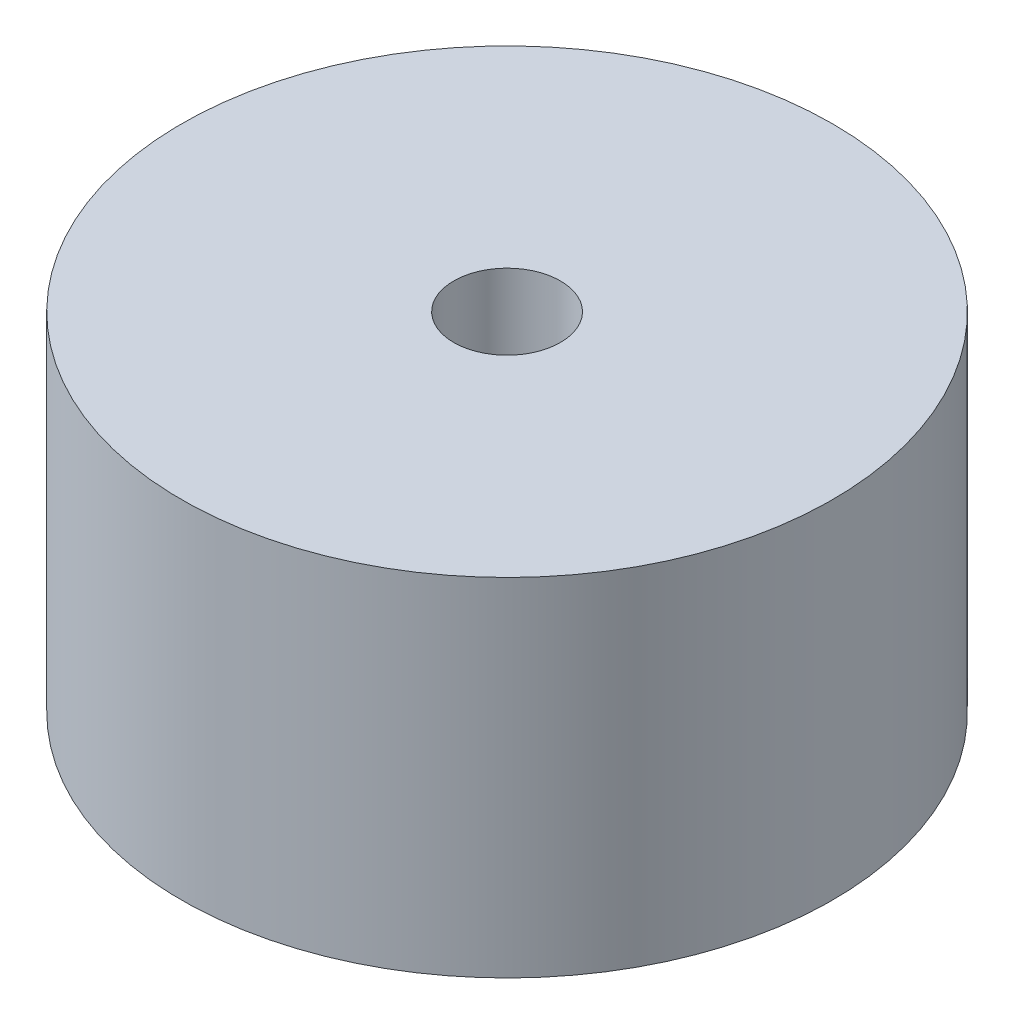
ISO-10303-21;
HEADER;
FILE_DESCRIPTION(('STEP AP214'),'2;1');
FILE_NAME('part.step','',(''),(''),'','','');
FILE_SCHEMA(('AUTOMOTIVE_DESIGN { 1 0 10303 214 1 1 1 1 }'));
ENDSEC;
DATA;
#1=APPLICATION_CONTEXT('core data for automotive mechanical design processes');
#2=APPLICATION_PROTOCOL_DEFINITION('international standard','automotive_design',2000,#1);
#3=PRODUCT_CONTEXT('',#1,'mechanical');
#4=PRODUCT('Part','Part','',(#3));
#5=PRODUCT_RELATED_PRODUCT_CATEGORY('part','',(#4));
#6=PRODUCT_DEFINITION_FORMATION('','',#4);
#7=PRODUCT_DEFINITION_CONTEXT('part definition',#1,'design');
#8=PRODUCT_DEFINITION('design','',#6,#7);
#9=PRODUCT_DEFINITION_SHAPE('','',#8);
#10=(LENGTH_UNIT() NAMED_UNIT(*) SI_UNIT(.MILLI.,.METRE.));
#11=(NAMED_UNIT(*) PLANE_ANGLE_UNIT() SI_UNIT($,.RADIAN.));
#12=(NAMED_UNIT(*) SI_UNIT($,.STERADIAN.) SOLID_ANGLE_UNIT());
#13=UNCERTAINTY_MEASURE_WITH_UNIT(LENGTH_MEASURE(1.E-05),#10,'distance_accuracy_value','');
#14=(GEOMETRIC_REPRESENTATION_CONTEXT(3) GLOBAL_UNCERTAINTY_ASSIGNED_CONTEXT((#13)) GLOBAL_UNIT_ASSIGNED_CONTEXT((#10,
#11,#12)) REPRESENTATION_CONTEXT('',''));
#15=CARTESIAN_POINT('',(0.,0.,0.));
#16=DIRECTION('',(0.,0.,1.));
#17=DIRECTION('',(1.,0.,0.));
#18=AXIS2_PLACEMENT_3D('',#15,#16,#17);
#19=CARTESIAN_POINT('',(19.4431838187371,6.5,18.3068938553047));
#20=DIRECTION('',(0.,-1.,0.));
#21=DIRECTION('',(0.,0.,-1.));
#22=AXIS2_PLACEMENT_3D('',#19,#20,#21);
#23=CYLINDRICAL_SURFACE('',#22,6.1);
#24=CARTESIAN_POINT('',(19.4431838187371,6.5,18.3068938553047));
#25=DIRECTION('',(0.,1.,0.));
#26=DIRECTION('',(0.,0.,1.));
#27=AXIS2_PLACEMENT_3D('',#24,#25,#26);
#28=CIRCLE('',#27,6.1);
#29=CARTESIAN_POINT('',(19.4431838187371,6.5,12.2068938553047));
#30=VERTEX_POINT('',#29);
#31=EDGE_CURVE('E10',#30,#30,#28,.T.);
#32=CARTESIAN_POINT('',(19.4431838187371,0.,18.3068938553047));
#33=DIRECTION('',(0.,1.,0.));
#34=DIRECTION('',(0.,0.,1.));
#35=AXIS2_PLACEMENT_3D('',#32,#33,#34);
#36=CIRCLE('',#35,6.1);
#37=CARTESIAN_POINT('',(19.4431838187371,0.,12.2068938553047));
#38=VERTEX_POINT('',#37);
#39=EDGE_CURVE('E34',#38,#38,#36,.T.);
#40=CARTESIAN_POINT('',(19.4431838187371,6.5,12.2068938553047));
#41=CARTESIAN_POINT('',(19.4431838187371,6.43229166666667,12.2068938553047));
#42=CARTESIAN_POINT('',(19.4431838187371,6.36458333333333,12.2068938553047));
#43=CARTESIAN_POINT('',(19.4431838187371,6.22916666666667,12.2068938553047));
#44=CARTESIAN_POINT('',(19.4431838187371,6.16145833333333,12.2068938553047));
#45=CARTESIAN_POINT('',(19.4431838187371,6.02604166666667,12.2068938553047));
#46=CARTESIAN_POINT('',(19.4431838187371,5.95833333333333,12.2068938553047));
#47=CARTESIAN_POINT('',(19.4431838187371,5.82291666666667,12.2068938553047));
#48=CARTESIAN_POINT('',(19.4431838187371,5.75520833333333,12.2068938553047));
#49=CARTESIAN_POINT('',(19.4431838187371,5.61979166666667,12.2068938553047));
#50=CARTESIAN_POINT('',(19.4431838187371,5.55208333333333,12.2068938553047));
#51=CARTESIAN_POINT('',(19.4431838187371,5.41666666666667,12.2068938553047));
#52=CARTESIAN_POINT('',(19.4431838187371,5.34895833333333,12.2068938553047));
#53=CARTESIAN_POINT('',(19.4431838187371,5.21354166666667,12.2068938553047));
#54=CARTESIAN_POINT('',(19.4431838187371,5.14583333333333,12.2068938553047));
#55=CARTESIAN_POINT('',(19.4431838187371,5.01041666666667,12.2068938553047));
#56=CARTESIAN_POINT('',(19.4431838187371,4.94270833333333,12.2068938553047));
#57=CARTESIAN_POINT('',(19.4431838187371,4.80729166666667,12.2068938553047));
#58=CARTESIAN_POINT('',(19.4431838187371,4.73958333333333,12.2068938553047));
#59=CARTESIAN_POINT('',(19.4431838187371,4.60416666666667,12.2068938553047));
#60=CARTESIAN_POINT('',(19.4431838187371,4.53645833333333,12.2068938553047));
#61=CARTESIAN_POINT('',(19.4431838187371,4.40104166666667,12.2068938553047));
#62=CARTESIAN_POINT('',(19.4431838187371,4.33333333333333,12.2068938553047));
#63=CARTESIAN_POINT('',(19.4431838187371,4.19791666666667,12.2068938553047));
#64=CARTESIAN_POINT('',(19.4431838187371,4.13020833333333,12.2068938553047));
#65=CARTESIAN_POINT('',(19.4431838187371,3.99479166666667,12.2068938553047));
#66=CARTESIAN_POINT('',(19.4431838187371,3.92708333333333,12.2068938553047));
#67=CARTESIAN_POINT('',(19.4431838187371,3.79166666666667,12.2068938553047));
#68=CARTESIAN_POINT('',(19.4431838187371,3.72395833333333,12.2068938553047));
#69=CARTESIAN_POINT('',(19.4431838187371,3.58854166666667,12.2068938553047));
#70=CARTESIAN_POINT('',(19.4431838187371,3.52083333333333,12.2068938553047));
#71=CARTESIAN_POINT('',(19.4431838187371,3.38541666666667,12.2068938553047));
#72=CARTESIAN_POINT('',(19.4431838187371,3.31770833333333,12.2068938553047));
#73=CARTESIAN_POINT('',(19.4431838187371,3.18229166666667,12.2068938553047));
#74=CARTESIAN_POINT('',(19.4431838187371,3.11458333333333,12.2068938553047));
#75=CARTESIAN_POINT('',(19.4431838187371,2.97916666666667,12.2068938553047));
#76=CARTESIAN_POINT('',(19.4431838187371,2.91145833333333,12.2068938553047));
#77=CARTESIAN_POINT('',(19.4431838187371,2.77604166666667,12.2068938553047));
#78=CARTESIAN_POINT('',(19.4431838187371,2.70833333333333,12.2068938553047));
#79=CARTESIAN_POINT('',(19.4431838187371,2.57291666666667,12.2068938553047));
#80=CARTESIAN_POINT('',(19.4431838187371,2.50520833333333,12.2068938553047));
#81=CARTESIAN_POINT('',(19.4431838187371,2.36979166666667,12.2068938553047));
#82=CARTESIAN_POINT('',(19.4431838187371,2.30208333333333,12.2068938553047));
#83=CARTESIAN_POINT('',(19.4431838187371,2.16666666666667,12.2068938553047));
#84=CARTESIAN_POINT('',(19.4431838187371,2.09895833333333,12.2068938553047));
#85=CARTESIAN_POINT('',(19.4431838187371,1.96354166666667,12.2068938553047));
#86=CARTESIAN_POINT('',(19.4431838187371,1.89583333333333,12.2068938553047));
#87=CARTESIAN_POINT('',(19.4431838187371,1.76041666666667,12.2068938553047));
#88=CARTESIAN_POINT('',(19.4431838187371,1.69270833333333,12.2068938553047));
#89=CARTESIAN_POINT('',(19.4431838187371,1.55729166666667,12.2068938553047));
#90=CARTESIAN_POINT('',(19.4431838187371,1.48958333333333,12.2068938553047));
#91=CARTESIAN_POINT('',(19.4431838187371,1.35416666666667,12.2068938553047));
#92=CARTESIAN_POINT('',(19.4431838187371,1.28645833333333,12.2068938553047));
#93=CARTESIAN_POINT('',(19.4431838187371,1.15104166666667,12.2068938553047));
#94=CARTESIAN_POINT('',(19.4431838187371,1.08333333333333,12.2068938553047));
#95=CARTESIAN_POINT('',(19.4431838187371,0.947916666666667,12.2068938553047));
#96=CARTESIAN_POINT('',(19.4431838187371,0.880208333333333,12.2068938553047));
#97=CARTESIAN_POINT('',(19.4431838187371,0.744791666666667,12.2068938553047));
#98=CARTESIAN_POINT('',(19.4431838187371,0.677083333333333,12.2068938553047));
#99=CARTESIAN_POINT('',(19.4431838187371,0.541666666666667,12.2068938553047));
#100=CARTESIAN_POINT('',(19.4431838187371,0.473958333333333,12.2068938553047));
#101=CARTESIAN_POINT('',(19.4431838187371,0.338541666666667,12.2068938553047));
#102=CARTESIAN_POINT('',(19.4431838187371,0.270833333333334,12.2068938553047));
#103=CARTESIAN_POINT('',(19.4431838187371,0.135416666666667,12.2068938553047));
#104=CARTESIAN_POINT('',(19.4431838187371,0.0677083333333334,12.2068938553047));
#105=CARTESIAN_POINT('',(19.4431838187371,0.,12.2068938553047));
#106=B_SPLINE_CURVE_WITH_KNOTS('',3,(#40,#41,#42,#43,#44,#45,#46,#47,#48,#49,#50,#51,#52,#53,
#54,#55,#56,#57,#58,#59,#60,#61,#62,#63,#64,#65,#66,#67,#68,#69,#70,#71,#72,#73,#74,#75,#76,#77,
#78,#79,#80,#81,#82,#83,#84,#85,#86,#87,#88,#89,#90,#91,#92,#93,#94,#95,#96,#97,#98,#99,#100,
#101,#102,#103,#104,#105),.UNSPECIFIED.,.F.,.F.,(4,2,2,2,2,2,2,2,2,2,2,2,2,2,2,2,2,2,2,2,2,2,2,
2,2,2,2,2,2,2,2,2,4),(0.,0.203125,0.40625,0.609375000000001,0.812500000000001,1.015625,1.21875,
1.421875,1.625,1.828125,2.03125,2.234375,2.4375,2.640625,2.84375,3.046875,3.25,3.453125,3.65625,
3.859375,4.0625,4.265625,4.46875,4.671875,4.875,5.078125,5.28125,5.484375,5.6875,5.890625,
6.09375,6.296875,6.5),.UNSPECIFIED.);
#107=EDGE_CURVE('BSEAM31',#30,#38,#106,.T.);
#108=ORIENTED_EDGE('',*,*,#31,.F.);
#109=ORIENTED_EDGE('',*,*,#39,.T.);
#110=ORIENTED_EDGE('',*,*,#107,.T.);
#111=ORIENTED_EDGE('',*,*,#107,.F.);
#112=EDGE_LOOP('',(#108,#110,#109,#111));
#113=FACE_BOUND('',#112,.T.);
#114=ADVANCED_FACE('F31',(#113),#23,.T.);
#115=CARTESIAN_POINT('',(19.4431838187371,6.5,18.3068938553047));
#116=DIRECTION('',(0.,1.,0.));
#117=DIRECTION('',(0.,0.,1.));
#118=AXIS2_PLACEMENT_3D('',#115,#116,#117);
#119=PLANE('',#118);
#120=CARTESIAN_POINT('',(19.4431838187371,6.5,18.3068938553047));
#121=DIRECTION('',(0.,1.,0.));
#122=DIRECTION('',(0.,0.,1.));
#123=AXIS2_PLACEMENT_3D('',#120,#121,#122);
#124=CIRCLE('',#123,1.);
#125=CARTESIAN_POINT('',(19.4431838187371,6.5,19.3068938553047));
#126=VERTEX_POINT('',#125);
#127=EDGE_CURVE('E43',#126,#126,#124,.T.);
#128=ORIENTED_EDGE('',*,*,#127,.F.);
#129=EDGE_LOOP('',(#128));
#130=FACE_BOUND('',#129,.T.);
#131=ORIENTED_EDGE('',*,*,#31,.T.);
#132=EDGE_LOOP('',(#131));
#133=FACE_BOUND('',#132,.T.);
#134=ADVANCED_FACE('F58',(#130,#133),#119,.T.);
#135=CARTESIAN_POINT('',(19.4431838187371,0.,18.3068938553047));
#136=DIRECTION('',(0.,1.,0.));
#137=DIRECTION('',(0.,0.,1.));
#138=AXIS2_PLACEMENT_3D('',#135,#136,#137);
#139=PLANE('',#138);
#140=ORIENTED_EDGE('',*,*,#39,.F.);
#141=EDGE_LOOP('',(#140));
#142=FACE_BOUND('',#141,.T.);
#143=ADVANCED_FACE('F54',(#142),#139,.F.);
#144=CARTESIAN_POINT('',(19.4431838187371,3.5,18.3068938553047));
#145=DIRECTION('',(0.,1.,0.));
#146=DIRECTION('',(0.,0.,1.));
#147=AXIS2_PLACEMENT_3D('',#144,#145,#146);
#148=CYLINDRICAL_SURFACE('',#147,1.);
#149=CARTESIAN_POINT('',(19.4431838187371,3.5,18.3068938553047));
#150=DIRECTION('',(0.,1.,0.));
#151=DIRECTION('',(0.,0.,1.));
#152=AXIS2_PLACEMENT_3D('',#149,#150,#151);
#153=CIRCLE('',#152,1.);
#154=CARTESIAN_POINT('',(19.4431838187371,3.5,19.3068938553047));
#155=VERTEX_POINT('',#154);
#156=EDGE_CURVE('E41',#155,#155,#153,.T.);
#157=ORIENTED_EDGE('',*,*,#156,.F.);
#158=EDGE_LOOP('',(#157));
#159=FACE_BOUND('',#158,.T.);
#160=ORIENTED_EDGE('',*,*,#127,.T.);
#161=EDGE_LOOP('',(#160));
#162=FACE_BOUND('',#161,.T.);
#163=ADVANCED_FACE('F51',(#159,#162),#148,.F.);
#164=CARTESIAN_POINT('',(19.4431838187371,3.5,18.3068938553047));
#165=DIRECTION('',(0.,1.,0.));
#166=DIRECTION('',(0.,0.,1.));
#167=AXIS2_PLACEMENT_3D('',#164,#165,#166);
#168=PLANE('',#167);
#169=ORIENTED_EDGE('',*,*,#156,.T.);
#170=EDGE_LOOP('',(#169));
#171=FACE_BOUND('',#170,.T.);
#172=ADVANCED_FACE('F49',(#171),#168,.T.);
#173=CLOSED_SHELL('',(#114,#134,#143,#163,#172));
#174=MANIFOLD_SOLID_BREP('B2',#173);
#175=ADVANCED_BREP_SHAPE_REPRESENTATION('',(#18,#174),#14);
#176=SHAPE_DEFINITION_REPRESENTATION(#9,#175);
ENDSEC;
END-ISO-10303-21;
